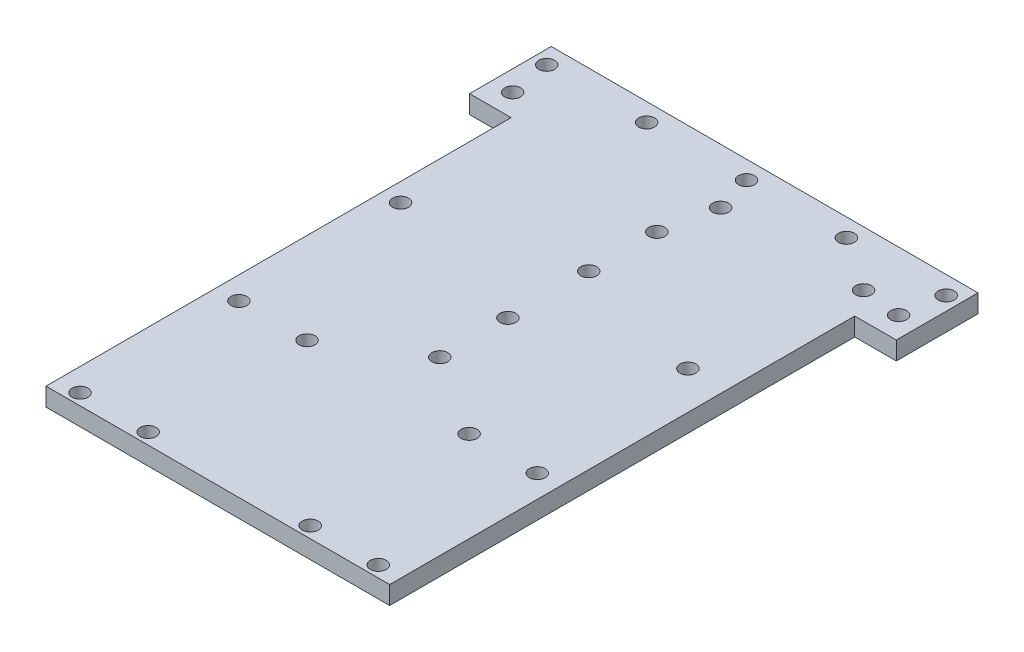
ISO-10303-21;
HEADER;
FILE_DESCRIPTION(('STEP AP214'),'2;1');
FILE_NAME('part.step','',(''),(''),'','','');
FILE_SCHEMA(('AUTOMOTIVE_DESIGN { 1 0 10303 214 1 1 1 1 }'));
ENDSEC;
DATA;
#1=APPLICATION_CONTEXT('core data for automotive mechanical design processes');
#2=APPLICATION_PROTOCOL_DEFINITION('international standard','automotive_design',2000,#1);
#3=PRODUCT_CONTEXT('',#1,'mechanical');
#4=PRODUCT('Part','Part','',(#3));
#5=PRODUCT_RELATED_PRODUCT_CATEGORY('part','',(#4));
#6=PRODUCT_DEFINITION_FORMATION('','',#4);
#7=PRODUCT_DEFINITION_CONTEXT('part definition',#1,'design');
#8=PRODUCT_DEFINITION('design','',#6,#7);
#9=PRODUCT_DEFINITION_SHAPE('','',#8);
#10=(LENGTH_UNIT() NAMED_UNIT(*) SI_UNIT(.MILLI.,.METRE.));
#11=(NAMED_UNIT(*) PLANE_ANGLE_UNIT() SI_UNIT($,.RADIAN.));
#12=(NAMED_UNIT(*) SI_UNIT($,.STERADIAN.) SOLID_ANGLE_UNIT());
#13=UNCERTAINTY_MEASURE_WITH_UNIT(LENGTH_MEASURE(1.E-05),#10,'distance_accuracy_value','');
#14=(GEOMETRIC_REPRESENTATION_CONTEXT(3) GLOBAL_UNCERTAINTY_ASSIGNED_CONTEXT((#13)) GLOBAL_UNIT_ASSIGNED_CONTEXT((#10,
#11,#12)) REPRESENTATION_CONTEXT('',''));
#15=CARTESIAN_POINT('',(0.,0.,0.));
#16=DIRECTION('',(0.,0.,1.));
#17=DIRECTION('',(1.,0.,0.));
#18=AXIS2_PLACEMENT_3D('',#15,#16,#17);
#19=CARTESIAN_POINT('',(37.85,4.,-21.35));
#20=DIRECTION('',(-1.,0.,0.));
#21=DIRECTION('',(0.,0.,1.));
#22=AXIS2_PLACEMENT_3D('',#19,#20,#21);
#23=PLANE('',#22);
#24=DIRECTION('',(0.,-1.,0.));
#25=VECTOR('',#24,1.);
#26=CARTESIAN_POINT('',(37.85,4.,-11.35));
#27=LINE('',#26,#25);
#28=CARTESIAN_POINT('',(37.85,4.,-11.35));
#29=VERTEX_POINT('',#28);
#30=CARTESIAN_POINT('',(37.85,0.,-11.35));
#31=VERTEX_POINT('',#30);
#32=EDGE_CURVE('E60',#29,#31,#27,.T.);
#33=ORIENTED_EDGE('',*,*,#32,.F.);
#34=DIRECTION('',(0.,0.,-1.));
#35=VECTOR('',#34,1.);
#36=CARTESIAN_POINT('',(37.85,4.,-21.35));
#37=LINE('',#36,#35);
#38=CARTESIAN_POINT('',(37.85,4.,91.1));
#39=VERTEX_POINT('',#38);
#40=EDGE_CURVE('E52',#39,#29,#37,.T.);
#41=ORIENTED_EDGE('',*,*,#40,.F.);
#42=DIRECTION('',(0.,-1.,0.));
#43=VECTOR('',#42,1.);
#44=CARTESIAN_POINT('',(37.85,4.,91.1));
#45=LINE('',#44,#43);
#46=CARTESIAN_POINT('',(37.85,0.,91.1));
#47=VERTEX_POINT('',#46);
#48=EDGE_CURVE('E298',#39,#47,#45,.T.);
#49=ORIENTED_EDGE('',*,*,#48,.T.);
#50=DIRECTION('',(0.,0.,-1.));
#51=VECTOR('',#50,1.);
#52=CARTESIAN_POINT('',(37.85,0.,-21.35));
#53=LINE('',#52,#51);
#54=EDGE_CURVE('E65',#47,#31,#53,.T.);
#55=ORIENTED_EDGE('',*,*,#54,.T.);
#56=EDGE_LOOP('',(#33,#41,#49,#55));
#57=FACE_BOUND('',#56,.T.);
#58=ADVANCED_FACE('F43',(#57),#23,.F.);
#59=CARTESIAN_POINT('',(-37.85,4.,-21.35));
#60=DIRECTION('',(1.,0.,0.));
#61=DIRECTION('',(0.,0.,-1.));
#62=AXIS2_PLACEMENT_3D('',#59,#60,#61);
#63=PLANE('',#62);
#64=DIRECTION('',(0.,-1.,0.));
#65=VECTOR('',#64,1.);
#66=CARTESIAN_POINT('',(-37.85,4.,-11.35));
#67=LINE('',#66,#65);
#68=CARTESIAN_POINT('',(-37.85,4.,-11.35));
#69=VERTEX_POINT('',#68);
#70=CARTESIAN_POINT('',(-37.85,0.,-11.35));
#71=VERTEX_POINT('',#70);
#72=EDGE_CURVE('E161',#69,#71,#67,.T.);
#73=ORIENTED_EDGE('',*,*,#72,.T.);
#74=DIRECTION('',(0.,0.,1.));
#75=VECTOR('',#74,1.);
#76=CARTESIAN_POINT('',(-37.85,0.,-21.35));
#77=LINE('',#76,#75);
#78=CARTESIAN_POINT('',(-37.85,0.,91.1));
#79=VERTEX_POINT('',#78);
#80=EDGE_CURVE('E46',#71,#79,#77,.T.);
#81=ORIENTED_EDGE('',*,*,#80,.T.);
#82=DIRECTION('',(0.,-1.,0.));
#83=VECTOR('',#82,1.);
#84=CARTESIAN_POINT('',(-37.85,4.,91.1));
#85=LINE('',#84,#83);
#86=CARTESIAN_POINT('',(-37.85,4.,91.1));
#87=VERTEX_POINT('',#86);
#88=EDGE_CURVE('E304',#87,#79,#85,.T.);
#89=ORIENTED_EDGE('',*,*,#88,.F.);
#90=DIRECTION('',(0.,0.,1.));
#91=VECTOR('',#90,1.);
#92=CARTESIAN_POINT('',(-37.85,4.,-21.35));
#93=LINE('',#92,#91);
#94=EDGE_CURVE('E11',#69,#87,#93,.T.);
#95=ORIENTED_EDGE('',*,*,#94,.F.);
#96=EDGE_LOOP('',(#73,#81,#89,#95));
#97=FACE_BOUND('',#96,.T.);
#98=ADVANCED_FACE('F378',(#97),#63,.F.);
#99=CARTESIAN_POINT('',(0.,4.,0.));
#100=DIRECTION('',(0.,1.,0.));
#101=DIRECTION('',(0.,0.,1.));
#102=AXIS2_PLACEMENT_3D('',#99,#100,#101);
#103=PLANE('',#102);
#104=ORIENTED_EDGE('',*,*,#40,.T.);
#105=DIRECTION('',(1.,0.,0.));
#106=VECTOR('',#105,1.);
#107=CARTESIAN_POINT('',(47.,4.,-11.35));
#108=LINE('',#107,#106);
#109=CARTESIAN_POINT('',(47.,4.,-11.35));
#110=VERTEX_POINT('',#109);
#111=EDGE_CURVE('E129',#29,#110,#108,.T.);
#112=ORIENTED_EDGE('',*,*,#111,.T.);
#113=DIRECTION('',(0.,0.,1.));
#114=VECTOR('',#113,1.);
#115=CARTESIAN_POINT('',(47.,4.,0.));
#116=LINE('',#115,#114);
#117=CARTESIAN_POINT('',(47.,4.,-29.35));
#118=VERTEX_POINT('',#117);
#119=EDGE_CURVE('E133',#118,#110,#116,.T.);
#120=ORIENTED_EDGE('',*,*,#119,.F.);
#121=DIRECTION('',(-1.,0.,0.));
#122=VECTOR('',#121,1.);
#123=CARTESIAN_POINT('',(-44.,4.,-29.35));
#124=LINE('',#123,#122);
#125=CARTESIAN_POINT('',(-47.,4.,-29.35));
#126=VERTEX_POINT('',#125);
#127=EDGE_CURVE('E224',#118,#126,#124,.T.);
#128=ORIENTED_EDGE('',*,*,#127,.T.);
#129=DIRECTION('',(0.,0.,1.));
#130=VECTOR('',#129,1.);
#131=CARTESIAN_POINT('',(-47.,4.,0.));
#132=LINE('',#131,#130);
#133=CARTESIAN_POINT('',(-47.,4.,-11.35));
#134=VERTEX_POINT('',#133);
#135=EDGE_CURVE('E212',#126,#134,#132,.T.);
#136=ORIENTED_EDGE('',*,*,#135,.T.);
#137=DIRECTION('',(1.,0.,0.));
#138=VECTOR('',#137,1.);
#139=CARTESIAN_POINT('',(-47.,4.,-11.35));
#140=LINE('',#139,#138);
#141=EDGE_CURVE('E158',#134,#69,#140,.T.);
#142=ORIENTED_EDGE('',*,*,#141,.T.);
#143=ORIENTED_EDGE('',*,*,#94,.T.);
#144=DIRECTION('',(1.,0.,0.));
#145=VECTOR('',#144,1.);
#146=CARTESIAN_POINT('',(-37.85,4.,91.1));
#147=LINE('',#146,#145);
#148=EDGE_CURVE('E294',#87,#39,#147,.T.);
#149=ORIENTED_EDGE('',*,*,#148,.T.);
#150=EDGE_LOOP('',(#104,#112,#120,#128,#136,#142,#143,#149));
#151=FACE_BOUND('',#150,.T.);
#152=CARTESIAN_POINT('',(-44.,4.,-25.35));
#153=DIRECTION('',(0.,1.,0.));
#154=DIRECTION('',(0.,0.,1.));
#155=AXIS2_PLACEMENT_3D('',#152,#153,#154);
#156=CIRCLE('',#155,1.75);
#157=CARTESIAN_POINT('',(-44.,4.,-23.6));
#158=VERTEX_POINT('',#157);
#159=EDGE_CURVE('E206',#158,#158,#156,.T.);
#160=ORIENTED_EDGE('',*,*,#159,.F.);
#161=EDGE_LOOP('',(#160));
#162=FACE_BOUND('',#161,.T.);
#163=CARTESIAN_POINT('',(0.,4.,-25.35));
#164=DIRECTION('',(0.,1.,0.));
#165=DIRECTION('',(0.,0.,1.));
#166=AXIS2_PLACEMENT_3D('',#163,#164,#165);
#167=CIRCLE('',#166,1.75);
#168=CARTESIAN_POINT('',(0.,4.,-23.6));
#169=VERTEX_POINT('',#168);
#170=EDGE_CURVE('E172',#169,#169,#167,.T.);
#171=ORIENTED_EDGE('',*,*,#170,.F.);
#172=EDGE_LOOP('',(#171));
#173=FACE_BOUND('',#172,.T.);
#174=CARTESIAN_POINT('',(44.,4.,-25.35));
#175=DIRECTION('',(0.,1.,0.));
#176=DIRECTION('',(0.,0.,1.));
#177=AXIS2_PLACEMENT_3D('',#174,#175,#176);
#178=CIRCLE('',#177,1.75);
#179=CARTESIAN_POINT('',(44.,4.,-23.6));
#180=VERTEX_POINT('',#179);
#181=EDGE_CURVE('E184',#180,#180,#178,.T.);
#182=ORIENTED_EDGE('',*,*,#181,.F.);
#183=EDGE_LOOP('',(#182));
#184=FACE_BOUND('',#183,.T.);
#185=CARTESIAN_POINT('',(22.,4.,-25.35));
#186=DIRECTION('',(0.,1.,0.));
#187=DIRECTION('',(0.,0.,1.));
#188=AXIS2_PLACEMENT_3D('',#185,#186,#187);
#189=CIRCLE('',#188,1.75);
#190=CARTESIAN_POINT('',(22.,4.,-23.6));
#191=VERTEX_POINT('',#190);
#192=EDGE_CURVE('E189',#191,#191,#189,.T.);
#193=ORIENTED_EDGE('',*,*,#192,.F.);
#194=EDGE_LOOP('',(#193));
#195=FACE_BOUND('',#194,.T.);
#196=CARTESIAN_POINT('',(-22.,4.,-25.35));
#197=DIRECTION('',(0.,1.,0.));
#198=DIRECTION('',(0.,0.,1.));
#199=AXIS2_PLACEMENT_3D('',#196,#197,#198);
#200=CIRCLE('',#199,1.75);
#201=CARTESIAN_POINT('',(-22.,4.,-23.6));
#202=VERTEX_POINT('',#201);
#203=EDGE_CURVE('E180',#202,#202,#200,.T.);
#204=ORIENTED_EDGE('',*,*,#203,.F.);
#205=EDGE_LOOP('',(#204));
#206=FACE_BOUND('',#205,.T.);
#207=CARTESIAN_POINT('',(0.,4.,-5.6));
#208=DIRECTION('',(0.,1.,0.));
#209=DIRECTION('',(0.,0.,1.));
#210=AXIS2_PLACEMENT_3D('',#207,#208,#209);
#211=CIRCLE('',#210,1.75);
#212=CARTESIAN_POINT('',(0.,4.,-3.85));
#213=VERTEX_POINT('',#212);
#214=EDGE_CURVE('E314',#213,#213,#211,.T.);
#215=ORIENTED_EDGE('',*,*,#214,.F.);
#216=EDGE_LOOP('',(#215));
#217=FACE_BOUND('',#216,.T.);
#218=CARTESIAN_POINT('',(0.,4.,9.4));
#219=DIRECTION('',(0.,1.,0.));
#220=DIRECTION('',(0.,0.,1.));
#221=AXIS2_PLACEMENT_3D('',#218,#219,#220);
#222=CIRCLE('',#221,1.75);
#223=CARTESIAN_POINT('',(0.,4.,11.15));
#224=VERTEX_POINT('',#223);
#225=EDGE_CURVE('E318',#224,#224,#222,.T.);
#226=ORIENTED_EDGE('',*,*,#225,.F.);
#227=EDGE_LOOP('',(#226));
#228=FACE_BOUND('',#227,.T.);
#229=CARTESIAN_POINT('',(29.5,4.,17.05));
#230=DIRECTION('',(0.,1.,0.));
#231=DIRECTION('',(0.,0.,1.));
#232=AXIS2_PLACEMENT_3D('',#229,#230,#231);
#233=CIRCLE('',#232,1.75);
#234=CARTESIAN_POINT('',(29.5,4.,18.8));
#235=VERTEX_POINT('',#234);
#236=EDGE_CURVE('E349',#235,#235,#233,.T.);
#237=ORIENTED_EDGE('',*,*,#236,.F.);
#238=EDGE_LOOP('',(#237));
#239=FACE_BOUND('',#238,.T.);
#240=CARTESIAN_POINT('',(2.39999999999999,4.,-17.25));
#241=DIRECTION('',(0.,1.,0.));
#242=DIRECTION('',(0.,0.,1.));
#243=AXIS2_PLACEMENT_3D('',#240,#241,#242);
#244=CIRCLE('',#243,1.75);
#245=CARTESIAN_POINT('',(2.39999999999999,4.,-15.5));
#246=VERTEX_POINT('',#245);
#247=EDGE_CURVE('E365',#246,#246,#244,.T.);
#248=ORIENTED_EDGE('',*,*,#247,.F.);
#249=EDGE_LOOP('',(#248));
#250=FACE_BOUND('',#249,.T.);
#251=CARTESIAN_POINT('',(-33.8,4.,17.05));
#252=DIRECTION('',(0.,1.,0.));
#253=DIRECTION('',(0.,0.,1.));
#254=AXIS2_PLACEMENT_3D('',#251,#252,#253);
#255=CIRCLE('',#254,1.75);
#256=CARTESIAN_POINT('',(-33.8,4.,18.8));
#257=VERTEX_POINT('',#256);
#258=EDGE_CURVE('E357',#257,#257,#255,.T.);
#259=ORIENTED_EDGE('',*,*,#258,.F.);
#260=EDGE_LOOP('',(#259));
#261=FACE_BOUND('',#260,.T.);
#262=CARTESIAN_POINT('',(33.9,4.,-17.25));
#263=DIRECTION('',(0.,1.,0.));
#264=DIRECTION('',(0.,0.,1.));
#265=AXIS2_PLACEMENT_3D('',#262,#263,#264);
#266=CIRCLE('',#265,1.75);
#267=CARTESIAN_POINT('',(33.9,4.,-15.5));
#268=VERTEX_POINT('',#267);
#269=EDGE_CURVE('E341',#268,#268,#266,.T.);
#270=ORIENTED_EDGE('',*,*,#269,.F.);
#271=EDGE_LOOP('',(#270));
#272=FACE_BOUND('',#271,.T.);
#273=CARTESIAN_POINT('',(0.,4.,42.2));
#274=DIRECTION('',(0.,1.,0.));
#275=DIRECTION('',(0.,0.,1.));
#276=AXIS2_PLACEMENT_3D('',#273,#274,#275);
#277=CIRCLE('',#276,1.75);
#278=CARTESIAN_POINT('',(0.,4.,43.95));
#279=VERTEX_POINT('',#278);
#280=EDGE_CURVE('E313',#279,#279,#277,.T.);
#281=ORIENTED_EDGE('',*,*,#280,.F.);
#282=EDGE_LOOP('',(#281));
#283=FACE_BOUND('',#282,.T.);
#284=CARTESIAN_POINT('',(0.,4.,27.2));
#285=DIRECTION('',(0.,1.,0.));
#286=DIRECTION('',(0.,0.,1.));
#287=AXIS2_PLACEMENT_3D('',#284,#285,#286);
#288=CIRCLE('',#287,1.75);
#289=CARTESIAN_POINT('',(0.,4.,28.95));
#290=VERTEX_POINT('',#289);
#291=EDGE_CURVE('E330',#290,#290,#288,.T.);
#292=ORIENTED_EDGE('',*,*,#291,.F.);
#293=EDGE_LOOP('',(#292));
#294=FACE_BOUND('',#293,.T.);
#295=CARTESIAN_POINT('',(17.85,4.,53.6));
#296=DIRECTION('',(0.,1.,0.));
#297=DIRECTION('',(0.,0.,-1.));
#298=AXIS2_PLACEMENT_3D('',#295,#296,#297);
#299=CIRCLE('',#298,1.75);
#300=CARTESIAN_POINT('',(17.85,4.,51.85));
#301=VERTEX_POINT('',#300);
#302=EDGE_CURVE('E238',#301,#301,#299,.T.);
#303=ORIENTED_EDGE('',*,*,#302,.F.);
#304=EDGE_LOOP('',(#303));
#305=FACE_BOUND('',#304,.T.);
#306=CARTESIAN_POINT('',(32.85,4.,88.6));
#307=DIRECTION('',(0.,1.,0.));
#308=DIRECTION('',(0.,0.,-1.));
#309=AXIS2_PLACEMENT_3D('',#306,#307,#308);
#310=CIRCLE('',#309,1.75);
#311=CARTESIAN_POINT('',(32.85,4.,86.85));
#312=VERTEX_POINT('',#311);
#313=EDGE_CURVE('E254',#312,#312,#310,.T.);
#314=ORIENTED_EDGE('',*,*,#313,.F.);
#315=EDGE_LOOP('',(#314));
#316=FACE_BOUND('',#315,.T.);
#317=CARTESIAN_POINT('',(-17.85,4.,88.6));
#318=DIRECTION('',(0.,1.,0.));
#319=DIRECTION('',(0.,0.,1.));
#320=AXIS2_PLACEMENT_3D('',#317,#318,#319);
#321=CIRCLE('',#320,1.75);
#322=CARTESIAN_POINT('',(-17.85,4.,90.35));
#323=VERTEX_POINT('',#322);
#324=EDGE_CURVE('E270',#323,#323,#321,.T.);
#325=ORIENTED_EDGE('',*,*,#324,.F.);
#326=EDGE_LOOP('',(#325));
#327=FACE_BOUND('',#326,.T.);
#328=CARTESIAN_POINT('',(-32.85,4.,53.6));
#329=DIRECTION('',(0.,1.,0.));
#330=DIRECTION('',(0.,0.,1.));
#331=AXIS2_PLACEMENT_3D('',#328,#329,#330);
#332=CIRCLE('',#331,1.75);
#333=CARTESIAN_POINT('',(-32.85,4.,55.35));
#334=VERTEX_POINT('',#333);
#335=EDGE_CURVE('E286',#334,#334,#332,.T.);
#336=ORIENTED_EDGE('',*,*,#335,.F.);
#337=EDGE_LOOP('',(#336));
#338=FACE_BOUND('',#337,.T.);
#339=CARTESIAN_POINT('',(-17.85,4.,53.6));
#340=DIRECTION('',(0.,1.,0.));
#341=DIRECTION('',(0.,0.,1.));
#342=AXIS2_PLACEMENT_3D('',#339,#340,#341);
#343=CIRCLE('',#342,1.75);
#344=CARTESIAN_POINT('',(-17.85,4.,55.35));
#345=VERTEX_POINT('',#344);
#346=EDGE_CURVE('E278',#345,#345,#343,.T.);
#347=ORIENTED_EDGE('',*,*,#346,.F.);
#348=EDGE_LOOP('',(#347));
#349=FACE_BOUND('',#348,.T.);
#350=CARTESIAN_POINT('',(-32.85,4.,88.6));
#351=DIRECTION('',(0.,1.,0.));
#352=DIRECTION('',(0.,0.,1.));
#353=AXIS2_PLACEMENT_3D('',#350,#351,#352);
#354=CIRCLE('',#353,1.75);
#355=CARTESIAN_POINT('',(-32.85,4.,90.35));
#356=VERTEX_POINT('',#355);
#357=EDGE_CURVE('E262',#356,#356,#354,.T.);
#358=ORIENTED_EDGE('',*,*,#357,.F.);
#359=EDGE_LOOP('',(#358));
#360=FACE_BOUND('',#359,.T.);
#361=CARTESIAN_POINT('',(17.85,4.,88.6));
#362=DIRECTION('',(0.,1.,0.));
#363=DIRECTION('',(0.,0.,-1.));
#364=AXIS2_PLACEMENT_3D('',#361,#362,#363);
#365=CIRCLE('',#364,1.75);
#366=CARTESIAN_POINT('',(17.85,4.,86.85));
#367=VERTEX_POINT('',#366);
#368=EDGE_CURVE('E246',#367,#367,#365,.T.);
#369=ORIENTED_EDGE('',*,*,#368,.F.);
#370=EDGE_LOOP('',(#369));
#371=FACE_BOUND('',#370,.T.);
#372=CARTESIAN_POINT('',(32.85,4.,53.6));
#373=DIRECTION('',(0.,1.,0.));
#374=DIRECTION('',(0.,0.,-1.));
#375=AXIS2_PLACEMENT_3D('',#372,#373,#374);
#376=CIRCLE('',#375,1.75);
#377=CARTESIAN_POINT('',(32.85,4.,51.85));
#378=VERTEX_POINT('',#377);
#379=EDGE_CURVE('E230',#378,#378,#376,.T.);
#380=ORIENTED_EDGE('',*,*,#379,.F.);
#381=EDGE_LOOP('',(#380));
#382=FACE_BOUND('',#381,.T.);
#383=CARTESIAN_POINT('',(-42.5,4.,-16.35));
#384=DIRECTION('',(0.,1.,0.));
#385=DIRECTION('',(0.,0.,1.));
#386=AXIS2_PLACEMENT_3D('',#383,#384,#385);
#387=CIRCLE('',#386,1.75);
#388=CARTESIAN_POINT('',(-42.5,4.,-14.6));
#389=VERTEX_POINT('',#388);
#390=EDGE_CURVE('E150',#389,#389,#387,.T.);
#391=ORIENTED_EDGE('',*,*,#390,.F.);
#392=EDGE_LOOP('',(#391));
#393=FACE_BOUND('',#392,.T.);
#394=CARTESIAN_POINT('',(42.5,4.,-16.35));
#395=DIRECTION('',(0.,1.,0.));
#396=DIRECTION('',(0.,0.,1.));
#397=AXIS2_PLACEMENT_3D('',#394,#395,#396);
#398=CIRCLE('',#397,1.75);
#399=CARTESIAN_POINT('',(42.5,4.,-14.6));
#400=VERTEX_POINT('',#399);
#401=EDGE_CURVE('E128',#400,#400,#398,.T.);
#402=ORIENTED_EDGE('',*,*,#401,.F.);
#403=EDGE_LOOP('',(#402));
#404=FACE_BOUND('',#403,.T.);
#405=ADVANCED_FACE('F388',(#151,#162,#173,#184,#195,#206,#217,#228,#239,#250,#261,#272,#283,
#294,#305,#316,#327,#338,#349,#360,#371,#382,#393,#404),#103,.T.);
#406=CARTESIAN_POINT('',(0.,0.,0.));
#407=DIRECTION('',(0.,1.,0.));
#408=DIRECTION('',(0.,0.,1.));
#409=AXIS2_PLACEMENT_3D('',#406,#407,#408);
#410=PLANE('',#409);
#411=DIRECTION('',(1.,0.,0.));
#412=VECTOR('',#411,1.);
#413=CARTESIAN_POINT('',(47.,0.,-11.35));
#414=LINE('',#413,#412);
#415=CARTESIAN_POINT('',(47.,0.,-11.35));
#416=VERTEX_POINT('',#415);
#417=EDGE_CURVE('E111',#31,#416,#414,.T.);
#418=ORIENTED_EDGE('',*,*,#417,.F.);
#419=ORIENTED_EDGE('',*,*,#54,.F.);
#420=DIRECTION('',(1.,0.,0.));
#421=VECTOR('',#420,1.);
#422=CARTESIAN_POINT('',(-37.85,0.,91.1));
#423=LINE('',#422,#421);
#424=EDGE_CURVE('E290',#79,#47,#423,.T.);
#425=ORIENTED_EDGE('',*,*,#424,.F.);
#426=ORIENTED_EDGE('',*,*,#80,.F.);
#427=DIRECTION('',(1.,0.,0.));
#428=VECTOR('',#427,1.);
#429=CARTESIAN_POINT('',(-47.,0.,-11.35));
#430=LINE('',#429,#428);
#431=CARTESIAN_POINT('',(-47.,0.,-11.35));
#432=VERTEX_POINT('',#431);
#433=EDGE_CURVE('E154',#432,#71,#430,.T.);
#434=ORIENTED_EDGE('',*,*,#433,.F.);
#435=DIRECTION('',(0.,0.,1.));
#436=VECTOR('',#435,1.);
#437=CARTESIAN_POINT('',(-47.,0.,0.));
#438=LINE('',#437,#436);
#439=CARTESIAN_POINT('',(-47.,0.,-29.35));
#440=VERTEX_POINT('',#439);
#441=EDGE_CURVE('E211',#440,#432,#438,.T.);
#442=ORIENTED_EDGE('',*,*,#441,.F.);
#443=DIRECTION('',(-1.,0.,0.));
#444=VECTOR('',#443,1.);
#445=CARTESIAN_POINT('',(-44.,0.,-29.35));
#446=LINE('',#445,#444);
#447=CARTESIAN_POINT('',(47.,0.,-29.35));
#448=VERTEX_POINT('',#447);
#449=EDGE_CURVE('E113',#448,#440,#446,.T.);
#450=ORIENTED_EDGE('',*,*,#449,.F.);
#451=DIRECTION('',(0.,0.,1.));
#452=VECTOR('',#451,1.);
#453=CARTESIAN_POINT('',(47.,0.,0.));
#454=LINE('',#453,#452);
#455=EDGE_CURVE('E107',#448,#416,#454,.T.);
#456=ORIENTED_EDGE('',*,*,#455,.T.);
#457=EDGE_LOOP('',(#418,#419,#425,#426,#434,#442,#450,#456));
#458=FACE_BOUND('',#457,.T.);
#459=CARTESIAN_POINT('',(0.,0.,-25.35));
#460=DIRECTION('',(0.,1.,0.));
#461=DIRECTION('',(0.,0.,1.));
#462=AXIS2_PLACEMENT_3D('',#459,#460,#461);
#463=CIRCLE('',#462,1.75);
#464=CARTESIAN_POINT('',(0.,0.,-23.6));
#465=VERTEX_POINT('',#464);
#466=EDGE_CURVE('E171',#465,#465,#463,.T.);
#467=ORIENTED_EDGE('',*,*,#466,.T.);
#468=EDGE_LOOP('',(#467));
#469=FACE_BOUND('',#468,.T.);
#470=CARTESIAN_POINT('',(22.,0.,-25.35));
#471=DIRECTION('',(0.,1.,0.));
#472=DIRECTION('',(0.,0.,1.));
#473=AXIS2_PLACEMENT_3D('',#470,#471,#472);
#474=CIRCLE('',#473,1.75);
#475=CARTESIAN_POINT('',(22.,0.,-23.6));
#476=VERTEX_POINT('',#475);
#477=EDGE_CURVE('E176',#476,#476,#474,.T.);
#478=ORIENTED_EDGE('',*,*,#477,.T.);
#479=EDGE_LOOP('',(#478));
#480=FACE_BOUND('',#479,.T.);
#481=CARTESIAN_POINT('',(-22.,0.,-25.35));
#482=DIRECTION('',(0.,1.,0.));
#483=DIRECTION('',(0.,0.,1.));
#484=AXIS2_PLACEMENT_3D('',#481,#482,#483);
#485=CIRCLE('',#484,1.75);
#486=CARTESIAN_POINT('',(-22.,0.,-23.6));
#487=VERTEX_POINT('',#486);
#488=EDGE_CURVE('E185',#487,#487,#485,.T.);
#489=ORIENTED_EDGE('',*,*,#488,.T.);
#490=EDGE_LOOP('',(#489));
#491=FACE_BOUND('',#490,.T.);
#492=CARTESIAN_POINT('',(44.,0.,-25.35));
#493=DIRECTION('',(0.,1.,0.));
#494=DIRECTION('',(0.,0.,1.));
#495=AXIS2_PLACEMENT_3D('',#492,#493,#494);
#496=CIRCLE('',#495,1.75);
#497=CARTESIAN_POINT('',(44.,0.,-23.6));
#498=VERTEX_POINT('',#497);
#499=EDGE_CURVE('E120',#498,#498,#496,.T.);
#500=ORIENTED_EDGE('',*,*,#499,.T.);
#501=EDGE_LOOP('',(#500));
#502=FACE_BOUND('',#501,.T.);
#503=CARTESIAN_POINT('',(-44.,0.,-25.35));
#504=DIRECTION('',(0.,1.,0.));
#505=DIRECTION('',(0.,0.,1.));
#506=AXIS2_PLACEMENT_3D('',#503,#504,#505);
#507=CIRCLE('',#506,1.75);
#508=CARTESIAN_POINT('',(-44.,0.,-23.6));
#509=VERTEX_POINT('',#508);
#510=EDGE_CURVE('E207',#509,#509,#507,.T.);
#511=ORIENTED_EDGE('',*,*,#510,.T.);
#512=EDGE_LOOP('',(#511));
#513=FACE_BOUND('',#512,.T.);
#514=CARTESIAN_POINT('',(0.,0.,-5.6));
#515=DIRECTION('',(0.,1.,0.));
#516=DIRECTION('',(0.,0.,1.));
#517=AXIS2_PLACEMENT_3D('',#514,#515,#516);
#518=CIRCLE('',#517,1.75);
#519=CARTESIAN_POINT('',(0.,0.,-3.85));
#520=VERTEX_POINT('',#519);
#521=EDGE_CURVE('E309',#520,#520,#518,.T.);
#522=ORIENTED_EDGE('',*,*,#521,.T.);
#523=EDGE_LOOP('',(#522));
#524=FACE_BOUND('',#523,.T.);
#525=CARTESIAN_POINT('',(0.,0.,9.4));
#526=DIRECTION('',(0.,1.,0.));
#527=DIRECTION('',(0.,0.,1.));
#528=AXIS2_PLACEMENT_3D('',#525,#526,#527);
#529=CIRCLE('',#528,1.75);
#530=CARTESIAN_POINT('',(0.,0.,11.15));
#531=VERTEX_POINT('',#530);
#532=EDGE_CURVE('E308',#531,#531,#529,.T.);
#533=ORIENTED_EDGE('',*,*,#532,.T.);
#534=EDGE_LOOP('',(#533));
#535=FACE_BOUND('',#534,.T.);
#536=CARTESIAN_POINT('',(2.39999999999999,0.,-17.25));
#537=DIRECTION('',(0.,1.,0.));
#538=DIRECTION('',(0.,0.,1.));
#539=AXIS2_PLACEMENT_3D('',#536,#537,#538);
#540=CIRCLE('',#539,1.75);
#541=CARTESIAN_POINT('',(2.39999999999999,0.,-15.5));
#542=VERTEX_POINT('',#541);
#543=EDGE_CURVE('E361',#542,#542,#540,.T.);
#544=ORIENTED_EDGE('',*,*,#543,.T.);
#545=EDGE_LOOP('',(#544));
#546=FACE_BOUND('',#545,.T.);
#547=CARTESIAN_POINT('',(-33.8,0.,17.05));
#548=DIRECTION('',(0.,1.,0.));
#549=DIRECTION('',(0.,0.,1.));
#550=AXIS2_PLACEMENT_3D('',#547,#548,#549);
#551=CIRCLE('',#550,1.75);
#552=CARTESIAN_POINT('',(-33.8,0.,18.8));
#553=VERTEX_POINT('',#552);
#554=EDGE_CURVE('E353',#553,#553,#551,.T.);
#555=ORIENTED_EDGE('',*,*,#554,.T.);
#556=EDGE_LOOP('',(#555));
#557=FACE_BOUND('',#556,.T.);
#558=CARTESIAN_POINT('',(29.5,0.,17.05));
#559=DIRECTION('',(0.,1.,0.));
#560=DIRECTION('',(0.,0.,1.));
#561=AXIS2_PLACEMENT_3D('',#558,#559,#560);
#562=CIRCLE('',#561,1.75);
#563=CARTESIAN_POINT('',(29.5,0.,18.8));
#564=VERTEX_POINT('',#563);
#565=EDGE_CURVE('E345',#564,#564,#562,.T.);
#566=ORIENTED_EDGE('',*,*,#565,.T.);
#567=EDGE_LOOP('',(#566));
#568=FACE_BOUND('',#567,.T.);
#569=CARTESIAN_POINT('',(33.9,0.,-17.25));
#570=DIRECTION('',(0.,1.,0.));
#571=DIRECTION('',(0.,0.,1.));
#572=AXIS2_PLACEMENT_3D('',#569,#570,#571);
#573=CIRCLE('',#572,1.75);
#574=CARTESIAN_POINT('',(33.9,0.,-15.5));
#575=VERTEX_POINT('',#574);
#576=EDGE_CURVE('E334',#575,#575,#573,.T.);
#577=ORIENTED_EDGE('',*,*,#576,.T.);
#578=EDGE_LOOP('',(#577));
#579=FACE_BOUND('',#578,.T.);
#580=CARTESIAN_POINT('',(0.,0.,42.2));
#581=DIRECTION('',(0.,1.,0.));
#582=DIRECTION('',(0.,0.,1.));
#583=AXIS2_PLACEMENT_3D('',#580,#581,#582);
#584=CIRCLE('',#583,1.75);
#585=CARTESIAN_POINT('',(0.,0.,43.95));
#586=VERTEX_POINT('',#585);
#587=EDGE_CURVE('E325',#586,#586,#584,.T.);
#588=ORIENTED_EDGE('',*,*,#587,.T.);
#589=EDGE_LOOP('',(#588));
#590=FACE_BOUND('',#589,.T.);
#591=CARTESIAN_POINT('',(0.,0.,27.2));
#592=DIRECTION('',(0.,1.,0.));
#593=DIRECTION('',(0.,0.,1.));
#594=AXIS2_PLACEMENT_3D('',#591,#592,#593);
#595=CIRCLE('',#594,1.75);
#596=CARTESIAN_POINT('',(0.,0.,28.95));
#597=VERTEX_POINT('',#596);
#598=EDGE_CURVE('E329',#597,#597,#595,.T.);
#599=ORIENTED_EDGE('',*,*,#598,.T.);
#600=EDGE_LOOP('',(#599));
#601=FACE_BOUND('',#600,.T.);
#602=CARTESIAN_POINT('',(-32.85,0.,53.6));
#603=DIRECTION('',(0.,1.,0.));
#604=DIRECTION('',(0.,0.,1.));
#605=AXIS2_PLACEMENT_3D('',#602,#603,#604);
#606=CIRCLE('',#605,1.75);
#607=CARTESIAN_POINT('',(-32.85,0.,55.35));
#608=VERTEX_POINT('',#607);
#609=EDGE_CURVE('E282',#608,#608,#606,.T.);
#610=ORIENTED_EDGE('',*,*,#609,.T.);
#611=EDGE_LOOP('',(#610));
#612=FACE_BOUND('',#611,.T.);
#613=CARTESIAN_POINT('',(-17.85,0.,53.6));
#614=DIRECTION('',(0.,1.,0.));
#615=DIRECTION('',(0.,0.,1.));
#616=AXIS2_PLACEMENT_3D('',#613,#614,#615);
#617=CIRCLE('',#616,1.75);
#618=CARTESIAN_POINT('',(-17.85,0.,55.35));
#619=VERTEX_POINT('',#618);
#620=EDGE_CURVE('E274',#619,#619,#617,.T.);
#621=ORIENTED_EDGE('',*,*,#620,.T.);
#622=EDGE_LOOP('',(#621));
#623=FACE_BOUND('',#622,.T.);
#624=CARTESIAN_POINT('',(-17.85,0.,88.6));
#625=DIRECTION('',(0.,1.,0.));
#626=DIRECTION('',(0.,0.,1.));
#627=AXIS2_PLACEMENT_3D('',#624,#625,#626);
#628=CIRCLE('',#627,1.75);
#629=CARTESIAN_POINT('',(-17.85,0.,90.35));
#630=VERTEX_POINT('',#629);
#631=EDGE_CURVE('E266',#630,#630,#628,.T.);
#632=ORIENTED_EDGE('',*,*,#631,.T.);
#633=EDGE_LOOP('',(#632));
#634=FACE_BOUND('',#633,.T.);
#635=CARTESIAN_POINT('',(-32.85,0.,88.6));
#636=DIRECTION('',(0.,1.,0.));
#637=DIRECTION('',(0.,0.,1.));
#638=AXIS2_PLACEMENT_3D('',#635,#636,#637);
#639=CIRCLE('',#638,1.75);
#640=CARTESIAN_POINT('',(-32.85,0.,90.35));
#641=VERTEX_POINT('',#640);
#642=EDGE_CURVE('E258',#641,#641,#639,.T.);
#643=ORIENTED_EDGE('',*,*,#642,.T.);
#644=EDGE_LOOP('',(#643));
#645=FACE_BOUND('',#644,.T.);
#646=CARTESIAN_POINT('',(32.85,0.,88.6));
#647=DIRECTION('',(0.,1.,0.));
#648=DIRECTION('',(0.,0.,-1.));
#649=AXIS2_PLACEMENT_3D('',#646,#647,#648);
#650=CIRCLE('',#649,1.75);
#651=CARTESIAN_POINT('',(32.85,0.,86.85));
#652=VERTEX_POINT('',#651);
#653=EDGE_CURVE('E250',#652,#652,#650,.T.);
#654=ORIENTED_EDGE('',*,*,#653,.T.);
#655=EDGE_LOOP('',(#654));
#656=FACE_BOUND('',#655,.T.);
#657=CARTESIAN_POINT('',(17.85,0.,88.6));
#658=DIRECTION('',(0.,1.,0.));
#659=DIRECTION('',(0.,0.,-1.));
#660=AXIS2_PLACEMENT_3D('',#657,#658,#659);
#661=CIRCLE('',#660,1.75);
#662=CARTESIAN_POINT('',(17.85,0.,86.85));
#663=VERTEX_POINT('',#662);
#664=EDGE_CURVE('E242',#663,#663,#661,.T.);
#665=ORIENTED_EDGE('',*,*,#664,.T.);
#666=EDGE_LOOP('',(#665));
#667=FACE_BOUND('',#666,.T.);
#668=CARTESIAN_POINT('',(17.85,0.,53.6));
#669=DIRECTION('',(0.,1.,0.));
#670=DIRECTION('',(0.,0.,-1.));
#671=AXIS2_PLACEMENT_3D('',#668,#669,#670);
#672=CIRCLE('',#671,1.75);
#673=CARTESIAN_POINT('',(17.85,0.,51.85));
#674=VERTEX_POINT('',#673);
#675=EDGE_CURVE('E234',#674,#674,#672,.T.);
#676=ORIENTED_EDGE('',*,*,#675,.T.);
#677=EDGE_LOOP('',(#676));
#678=FACE_BOUND('',#677,.T.);
#679=CARTESIAN_POINT('',(32.85,0.,53.6));
#680=DIRECTION('',(0.,1.,0.));
#681=DIRECTION('',(0.,0.,-1.));
#682=AXIS2_PLACEMENT_3D('',#679,#680,#681);
#683=CIRCLE('',#682,1.75);
#684=CARTESIAN_POINT('',(32.85,0.,51.85));
#685=VERTEX_POINT('',#684);
#686=EDGE_CURVE('E227',#685,#685,#683,.T.);
#687=ORIENTED_EDGE('',*,*,#686,.T.);
#688=EDGE_LOOP('',(#687));
#689=FACE_BOUND('',#688,.T.);
#690=CARTESIAN_POINT('',(-42.5,0.,-16.35));
#691=DIRECTION('',(0.,1.,0.));
#692=DIRECTION('',(0.,0.,1.));
#693=AXIS2_PLACEMENT_3D('',#690,#691,#692);
#694=CIRCLE('',#693,1.75);
#695=CARTESIAN_POINT('',(-42.5,0.,-14.6));
#696=VERTEX_POINT('',#695);
#697=EDGE_CURVE('E146',#696,#696,#694,.T.);
#698=ORIENTED_EDGE('',*,*,#697,.T.);
#699=EDGE_LOOP('',(#698));
#700=FACE_BOUND('',#699,.T.);
#701=CARTESIAN_POINT('',(42.5,0.,-16.35));
#702=DIRECTION('',(0.,1.,0.));
#703=DIRECTION('',(0.,0.,1.));
#704=AXIS2_PLACEMENT_3D('',#701,#702,#703);
#705=CIRCLE('',#704,1.75);
#706=CARTESIAN_POINT('',(42.5,0.,-14.6));
#707=VERTEX_POINT('',#706);
#708=EDGE_CURVE('E142',#707,#707,#705,.T.);
#709=ORIENTED_EDGE('',*,*,#708,.T.);
#710=EDGE_LOOP('',(#709));
#711=FACE_BOUND('',#710,.T.);
#712=ADVANCED_FACE('F109',(#458,#469,#480,#491,#502,#513,#524,#535,#546,#557,#568,#579,#590,
#601,#612,#623,#634,#645,#656,#667,#678,#689,#700,#711),#410,.F.);
#713=CARTESIAN_POINT('',(2.39999999999999,4.,-17.25));
#714=DIRECTION('',(0.,-1.,0.));
#715=DIRECTION('',(0.,0.,-1.));
#716=AXIS2_PLACEMENT_3D('',#713,#714,#715);
#717=CYLINDRICAL_SURFACE('',#716,1.75);
#718=ORIENTED_EDGE('',*,*,#247,.T.);
#719=EDGE_LOOP('',(#718));
#720=FACE_BOUND('',#719,.T.);
#721=ORIENTED_EDGE('',*,*,#543,.F.);
#722=EDGE_LOOP('',(#721));
#723=FACE_BOUND('',#722,.T.);
#724=ADVANCED_FACE('F423',(#720,#723),#717,.F.);
#725=CARTESIAN_POINT('',(-33.8,4.,17.05));
#726=DIRECTION('',(0.,-1.,0.));
#727=DIRECTION('',(0.,0.,-1.));
#728=AXIS2_PLACEMENT_3D('',#725,#726,#727);
#729=CYLINDRICAL_SURFACE('',#728,1.75);
#730=ORIENTED_EDGE('',*,*,#258,.T.);
#731=EDGE_LOOP('',(#730));
#732=FACE_BOUND('',#731,.T.);
#733=ORIENTED_EDGE('',*,*,#554,.F.);
#734=EDGE_LOOP('',(#733));
#735=FACE_BOUND('',#734,.T.);
#736=ADVANCED_FACE('F427',(#732,#735),#729,.F.);
#737=CARTESIAN_POINT('',(29.5,4.,17.05));
#738=DIRECTION('',(0.,-1.,0.));
#739=DIRECTION('',(0.,0.,-1.));
#740=AXIS2_PLACEMENT_3D('',#737,#738,#739);
#741=CYLINDRICAL_SURFACE('',#740,1.75);
#742=ORIENTED_EDGE('',*,*,#236,.T.);
#743=EDGE_LOOP('',(#742));
#744=FACE_BOUND('',#743,.T.);
#745=ORIENTED_EDGE('',*,*,#565,.F.);
#746=EDGE_LOOP('',(#745));
#747=FACE_BOUND('',#746,.T.);
#748=ADVANCED_FACE('F431',(#744,#747),#741,.F.);
#749=CARTESIAN_POINT('',(33.9,4.,-17.25));
#750=DIRECTION('',(0.,-1.,0.));
#751=DIRECTION('',(0.,0.,-1.));
#752=AXIS2_PLACEMENT_3D('',#749,#750,#751);
#753=CYLINDRICAL_SURFACE('',#752,1.75);
#754=ORIENTED_EDGE('',*,*,#269,.T.);
#755=EDGE_LOOP('',(#754));
#756=FACE_BOUND('',#755,.T.);
#757=ORIENTED_EDGE('',*,*,#576,.F.);
#758=EDGE_LOOP('',(#757));
#759=FACE_BOUND('',#758,.T.);
#760=ADVANCED_FACE('F435',(#756,#759),#753,.F.);
#761=CARTESIAN_POINT('',(0.,0.,27.2));
#762=DIRECTION('',(0.,1.,0.));
#763=DIRECTION('',(0.,0.,1.));
#764=AXIS2_PLACEMENT_3D('',#761,#762,#763);
#765=CYLINDRICAL_SURFACE('',#764,1.75);
#766=ORIENTED_EDGE('',*,*,#598,.F.);
#767=EDGE_LOOP('',(#766));
#768=FACE_BOUND('',#767,.T.);
#769=ORIENTED_EDGE('',*,*,#291,.T.);
#770=EDGE_LOOP('',(#769));
#771=FACE_BOUND('',#770,.T.);
#772=ADVANCED_FACE('F439',(#768,#771),#765,.F.);
#773=CARTESIAN_POINT('',(0.,0.,42.2));
#774=DIRECTION('',(0.,1.,0.));
#775=DIRECTION('',(0.,0.,1.));
#776=AXIS2_PLACEMENT_3D('',#773,#774,#775);
#777=CYLINDRICAL_SURFACE('',#776,1.75);
#778=ORIENTED_EDGE('',*,*,#587,.F.);
#779=EDGE_LOOP('',(#778));
#780=FACE_BOUND('',#779,.T.);
#781=ORIENTED_EDGE('',*,*,#280,.T.);
#782=EDGE_LOOP('',(#781));
#783=FACE_BOUND('',#782,.T.);
#784=ADVANCED_FACE('F441',(#780,#783),#777,.F.);
#785=CARTESIAN_POINT('',(0.,0.,9.4));
#786=DIRECTION('',(0.,1.,0.));
#787=DIRECTION('',(0.,0.,1.));
#788=AXIS2_PLACEMENT_3D('',#785,#786,#787);
#789=CYLINDRICAL_SURFACE('',#788,1.75);
#790=ORIENTED_EDGE('',*,*,#532,.F.);
#791=EDGE_LOOP('',(#790));
#792=FACE_BOUND('',#791,.T.);
#793=ORIENTED_EDGE('',*,*,#225,.T.);
#794=EDGE_LOOP('',(#793));
#795=FACE_BOUND('',#794,.T.);
#796=ADVANCED_FACE('F444',(#792,#795),#789,.F.);
#797=CARTESIAN_POINT('',(0.,0.,-5.6));
#798=DIRECTION('',(0.,1.,0.));
#799=DIRECTION('',(0.,0.,1.));
#800=AXIS2_PLACEMENT_3D('',#797,#798,#799);
#801=CYLINDRICAL_SURFACE('',#800,1.75);
#802=ORIENTED_EDGE('',*,*,#521,.F.);
#803=EDGE_LOOP('',(#802));
#804=FACE_BOUND('',#803,.T.);
#805=ORIENTED_EDGE('',*,*,#214,.T.);
#806=EDGE_LOOP('',(#805));
#807=FACE_BOUND('',#806,.T.);
#808=ADVANCED_FACE('F451',(#804,#807),#801,.F.);
#809=CARTESIAN_POINT('',(-37.85,4.,91.1));
#810=DIRECTION('',(0.,0.,-1.));
#811=DIRECTION('',(-1.,0.,0.));
#812=AXIS2_PLACEMENT_3D('',#809,#810,#811);
#813=PLANE('',#812);
#814=ORIENTED_EDGE('',*,*,#424,.T.);
#815=ORIENTED_EDGE('',*,*,#48,.F.);
#816=ORIENTED_EDGE('',*,*,#148,.F.);
#817=ORIENTED_EDGE('',*,*,#88,.T.);
#818=EDGE_LOOP('',(#814,#815,#816,#817));
#819=FACE_BOUND('',#818,.T.);
#820=ADVANCED_FACE('F385',(#819),#813,.F.);
#821=CARTESIAN_POINT('',(-32.85,4.,53.6));
#822=DIRECTION('',(0.,-1.,0.));
#823=DIRECTION('',(0.,0.,-1.));
#824=AXIS2_PLACEMENT_3D('',#821,#822,#823);
#825=CYLINDRICAL_SURFACE('',#824,1.75);
#826=ORIENTED_EDGE('',*,*,#335,.T.);
#827=EDGE_LOOP('',(#826));
#828=FACE_BOUND('',#827,.T.);
#829=ORIENTED_EDGE('',*,*,#609,.F.);
#830=EDGE_LOOP('',(#829));
#831=FACE_BOUND('',#830,.T.);
#832=ADVANCED_FACE('F458',(#828,#831),#825,.F.);
#833=CARTESIAN_POINT('',(-17.85,4.,53.6));
#834=DIRECTION('',(0.,-1.,0.));
#835=DIRECTION('',(0.,0.,-1.));
#836=AXIS2_PLACEMENT_3D('',#833,#834,#835);
#837=CYLINDRICAL_SURFACE('',#836,1.75);
#838=ORIENTED_EDGE('',*,*,#346,.T.);
#839=EDGE_LOOP('',(#838));
#840=FACE_BOUND('',#839,.T.);
#841=ORIENTED_EDGE('',*,*,#620,.F.);
#842=EDGE_LOOP('',(#841));
#843=FACE_BOUND('',#842,.T.);
#844=ADVANCED_FACE('F461',(#840,#843),#837,.F.);
#845=CARTESIAN_POINT('',(-17.85,4.,88.6));
#846=DIRECTION('',(0.,-1.,0.));
#847=DIRECTION('',(0.,0.,-1.));
#848=AXIS2_PLACEMENT_3D('',#845,#846,#847);
#849=CYLINDRICAL_SURFACE('',#848,1.75);
#850=ORIENTED_EDGE('',*,*,#324,.T.);
#851=EDGE_LOOP('',(#850));
#852=FACE_BOUND('',#851,.T.);
#853=ORIENTED_EDGE('',*,*,#631,.F.);
#854=EDGE_LOOP('',(#853));
#855=FACE_BOUND('',#854,.T.);
#856=ADVANCED_FACE('F465',(#852,#855),#849,.F.);
#857=CARTESIAN_POINT('',(-32.85,4.,88.6));
#858=DIRECTION('',(0.,-1.,0.));
#859=DIRECTION('',(0.,0.,-1.));
#860=AXIS2_PLACEMENT_3D('',#857,#858,#859);
#861=CYLINDRICAL_SURFACE('',#860,1.75);
#862=ORIENTED_EDGE('',*,*,#357,.T.);
#863=EDGE_LOOP('',(#862));
#864=FACE_BOUND('',#863,.T.);
#865=ORIENTED_EDGE('',*,*,#642,.F.);
#866=EDGE_LOOP('',(#865));
#867=FACE_BOUND('',#866,.T.);
#868=ADVANCED_FACE('F469',(#864,#867),#861,.F.);
#869=CARTESIAN_POINT('',(32.85,4.,88.6));
#870=DIRECTION('',(0.,-1.,0.));
#871=DIRECTION('',(0.,0.,-1.));
#872=AXIS2_PLACEMENT_3D('',#869,#870,#871);
#873=CYLINDRICAL_SURFACE('',#872,1.75);
#874=ORIENTED_EDGE('',*,*,#313,.T.);
#875=EDGE_LOOP('',(#874));
#876=FACE_BOUND('',#875,.T.);
#877=ORIENTED_EDGE('',*,*,#653,.F.);
#878=EDGE_LOOP('',(#877));
#879=FACE_BOUND('',#878,.T.);
#880=ADVANCED_FACE('F473',(#876,#879),#873,.F.);
#881=CARTESIAN_POINT('',(17.85,4.,88.6));
#882=DIRECTION('',(0.,-1.,0.));
#883=DIRECTION('',(0.,0.,-1.));
#884=AXIS2_PLACEMENT_3D('',#881,#882,#883);
#885=CYLINDRICAL_SURFACE('',#884,1.75);
#886=ORIENTED_EDGE('',*,*,#368,.T.);
#887=EDGE_LOOP('',(#886));
#888=FACE_BOUND('',#887,.T.);
#889=ORIENTED_EDGE('',*,*,#664,.F.);
#890=EDGE_LOOP('',(#889));
#891=FACE_BOUND('',#890,.T.);
#892=ADVANCED_FACE('F477',(#888,#891),#885,.F.);
#893=CARTESIAN_POINT('',(17.85,4.,53.6));
#894=DIRECTION('',(0.,-1.,0.));
#895=DIRECTION('',(0.,0.,-1.));
#896=AXIS2_PLACEMENT_3D('',#893,#894,#895);
#897=CYLINDRICAL_SURFACE('',#896,1.75);
#898=ORIENTED_EDGE('',*,*,#302,.T.);
#899=EDGE_LOOP('',(#898));
#900=FACE_BOUND('',#899,.T.);
#901=ORIENTED_EDGE('',*,*,#675,.F.);
#902=EDGE_LOOP('',(#901));
#903=FACE_BOUND('',#902,.T.);
#904=ADVANCED_FACE('F410',(#900,#903),#897,.F.);
#905=CARTESIAN_POINT('',(32.85,4.,53.6));
#906=DIRECTION('',(0.,-1.,0.));
#907=DIRECTION('',(0.,0.,-1.));
#908=AXIS2_PLACEMENT_3D('',#905,#906,#907);
#909=CYLINDRICAL_SURFACE('',#908,1.75);
#910=ORIENTED_EDGE('',*,*,#379,.T.);
#911=EDGE_LOOP('',(#910));
#912=FACE_BOUND('',#911,.T.);
#913=ORIENTED_EDGE('',*,*,#686,.F.);
#914=EDGE_LOOP('',(#913));
#915=FACE_BOUND('',#914,.T.);
#916=ADVANCED_FACE('F402',(#912,#915),#909,.F.);
#917=CARTESIAN_POINT('',(-44.,4.,-29.35));
#918=DIRECTION('',(0.,0.,1.));
#919=DIRECTION('',(1.,0.,0.));
#920=AXIS2_PLACEMENT_3D('',#917,#918,#919);
#921=PLANE('',#920);
#922=ORIENTED_EDGE('',*,*,#449,.T.);
#923=DIRECTION('',(0.,1.,0.));
#924=VECTOR('',#923,1.);
#925=CARTESIAN_POINT('',(-47.,0.,-29.35));
#926=LINE('',#925,#924);
#927=EDGE_CURVE('E215',#440,#126,#926,.T.);
#928=ORIENTED_EDGE('',*,*,#927,.T.);
#929=ORIENTED_EDGE('',*,*,#127,.F.);
#930=DIRECTION('',(0.,1.,0.));
#931=VECTOR('',#930,1.);
#932=CARTESIAN_POINT('',(47.,0.,-29.35));
#933=LINE('',#932,#931);
#934=EDGE_CURVE('E119',#448,#118,#933,.T.);
#935=ORIENTED_EDGE('',*,*,#934,.F.);
#936=EDGE_LOOP('',(#922,#928,#929,#935));
#937=FACE_BOUND('',#936,.T.);
#938=ADVANCED_FACE('F399',(#937),#921,.F.);
#939=CARTESIAN_POINT('',(-44.,0.,-25.35));
#940=DIRECTION('',(0.,1.,0.));
#941=DIRECTION('',(0.,0.,1.));
#942=AXIS2_PLACEMENT_3D('',#939,#940,#941);
#943=CYLINDRICAL_SURFACE('',#942,1.75);
#944=ORIENTED_EDGE('',*,*,#159,.T.);
#945=EDGE_LOOP('',(#944));
#946=FACE_BOUND('',#945,.T.);
#947=ORIENTED_EDGE('',*,*,#510,.F.);
#948=EDGE_LOOP('',(#947));
#949=FACE_BOUND('',#948,.T.);
#950=ADVANCED_FACE('F401',(#946,#949),#943,.F.);
#951=CARTESIAN_POINT('',(-47.,0.,0.));
#952=DIRECTION('',(-1.,0.,0.));
#953=DIRECTION('',(0.,0.,1.));
#954=AXIS2_PLACEMENT_3D('',#951,#952,#953);
#955=PLANE('',#954);
#956=ORIENTED_EDGE('',*,*,#135,.F.);
#957=ORIENTED_EDGE('',*,*,#927,.F.);
#958=ORIENTED_EDGE('',*,*,#441,.T.);
#959=DIRECTION('',(0.,-1.,0.));
#960=VECTOR('',#959,1.);
#961=CARTESIAN_POINT('',(-47.,4.,-11.35));
#962=LINE('',#961,#960);
#963=EDGE_CURVE('E167',#134,#432,#962,.T.);
#964=ORIENTED_EDGE('',*,*,#963,.F.);
#965=EDGE_LOOP('',(#956,#957,#958,#964));
#966=FACE_BOUND('',#965,.T.);
#967=ADVANCED_FACE('F397',(#966),#955,.T.);
#968=CARTESIAN_POINT('',(44.,0.,-25.35));
#969=DIRECTION('',(0.,1.,0.));
#970=DIRECTION('',(0.,0.,1.));
#971=AXIS2_PLACEMENT_3D('',#968,#969,#970);
#972=CYLINDRICAL_SURFACE('',#971,1.75);
#973=ORIENTED_EDGE('',*,*,#181,.T.);
#974=EDGE_LOOP('',(#973));
#975=FACE_BOUND('',#974,.T.);
#976=ORIENTED_EDGE('',*,*,#499,.F.);
#977=EDGE_LOOP('',(#976));
#978=FACE_BOUND('',#977,.T.);
#979=ADVANCED_FACE('F526',(#975,#978),#972,.F.);
#980=CARTESIAN_POINT('',(47.,0.,0.));
#981=DIRECTION('',(-1.,0.,0.));
#982=DIRECTION('',(0.,0.,1.));
#983=AXIS2_PLACEMENT_3D('',#980,#981,#982);
#984=PLANE('',#983);
#985=ORIENTED_EDGE('',*,*,#119,.T.);
#986=DIRECTION('',(0.,-1.,0.));
#987=VECTOR('',#986,1.);
#988=CARTESIAN_POINT('',(47.,4.,-11.35));
#989=LINE('',#988,#987);
#990=EDGE_CURVE('E126',#110,#416,#989,.T.);
#991=ORIENTED_EDGE('',*,*,#990,.T.);
#992=ORIENTED_EDGE('',*,*,#455,.F.);
#993=ORIENTED_EDGE('',*,*,#934,.T.);
#994=EDGE_LOOP('',(#985,#991,#992,#993));
#995=FACE_BOUND('',#994,.T.);
#996=ADVANCED_FACE('F131',(#995),#984,.F.);
#997=CARTESIAN_POINT('',(-22.,0.,-25.35));
#998=DIRECTION('',(0.,1.,0.));
#999=DIRECTION('',(0.,0.,1.));
#1000=AXIS2_PLACEMENT_3D('',#997,#998,#999);
#1001=CYLINDRICAL_SURFACE('',#1000,1.75);
#1002=ORIENTED_EDGE('',*,*,#488,.F.);
#1003=EDGE_LOOP('',(#1002));
#1004=FACE_BOUND('',#1003,.T.);
#1005=ORIENTED_EDGE('',*,*,#203,.T.);
#1006=EDGE_LOOP('',(#1005));
#1007=FACE_BOUND('',#1006,.T.);
#1008=ADVANCED_FACE('F517',(#1004,#1007),#1001,.F.);
#1009=CARTESIAN_POINT('',(22.,0.,-25.35));
#1010=DIRECTION('',(0.,1.,0.));
#1011=DIRECTION('',(0.,0.,1.));
#1012=AXIS2_PLACEMENT_3D('',#1009,#1010,#1011);
#1013=CYLINDRICAL_SURFACE('',#1012,1.75);
#1014=ORIENTED_EDGE('',*,*,#477,.F.);
#1015=EDGE_LOOP('',(#1014));
#1016=FACE_BOUND('',#1015,.T.);
#1017=ORIENTED_EDGE('',*,*,#192,.T.);
#1018=EDGE_LOOP('',(#1017));
#1019=FACE_BOUND('',#1018,.T.);
#1020=ADVANCED_FACE('F515',(#1016,#1019),#1013,.F.);
#1021=CARTESIAN_POINT('',(0.,0.,-25.35));
#1022=DIRECTION('',(0.,1.,0.));
#1023=DIRECTION('',(0.,0.,1.));
#1024=AXIS2_PLACEMENT_3D('',#1021,#1022,#1023);
#1025=CYLINDRICAL_SURFACE('',#1024,1.75);
#1026=ORIENTED_EDGE('',*,*,#466,.F.);
#1027=EDGE_LOOP('',(#1026));
#1028=FACE_BOUND('',#1027,.T.);
#1029=ORIENTED_EDGE('',*,*,#170,.T.);
#1030=EDGE_LOOP('',(#1029));
#1031=FACE_BOUND('',#1030,.T.);
#1032=ADVANCED_FACE('F512',(#1028,#1031),#1025,.F.);
#1033=CARTESIAN_POINT('',(-47.,4.,-11.35));
#1034=DIRECTION('',(0.,0.,-1.));
#1035=DIRECTION('',(-1.,0.,0.));
#1036=AXIS2_PLACEMENT_3D('',#1033,#1034,#1035);
#1037=PLANE('',#1036);
#1038=ORIENTED_EDGE('',*,*,#433,.T.);
#1039=ORIENTED_EDGE('',*,*,#72,.F.);
#1040=ORIENTED_EDGE('',*,*,#141,.F.);
#1041=ORIENTED_EDGE('',*,*,#963,.T.);
#1042=EDGE_LOOP('',(#1038,#1039,#1040,#1041));
#1043=FACE_BOUND('',#1042,.T.);
#1044=ADVANCED_FACE('F394',(#1043),#1037,.F.);
#1045=CARTESIAN_POINT('',(-42.5,4.,-16.35));
#1046=DIRECTION('',(0.,-1.,0.));
#1047=DIRECTION('',(0.,0.,-1.));
#1048=AXIS2_PLACEMENT_3D('',#1045,#1046,#1047);
#1049=CYLINDRICAL_SURFACE('',#1048,1.75);
#1050=ORIENTED_EDGE('',*,*,#390,.T.);
#1051=EDGE_LOOP('',(#1050));
#1052=FACE_BOUND('',#1051,.T.);
#1053=ORIENTED_EDGE('',*,*,#697,.F.);
#1054=EDGE_LOOP('',(#1053));
#1055=FACE_BOUND('',#1054,.T.);
#1056=ADVANCED_FACE('F504',(#1052,#1055),#1049,.F.);
#1057=CARTESIAN_POINT('',(47.,4.,-11.35));
#1058=DIRECTION('',(0.,0.,-1.));
#1059=DIRECTION('',(-1.,0.,0.));
#1060=AXIS2_PLACEMENT_3D('',#1057,#1058,#1059);
#1061=PLANE('',#1060);
#1062=ORIENTED_EDGE('',*,*,#417,.T.);
#1063=ORIENTED_EDGE('',*,*,#990,.F.);
#1064=ORIENTED_EDGE('',*,*,#111,.F.);
#1065=ORIENTED_EDGE('',*,*,#32,.T.);
#1066=EDGE_LOOP('',(#1062,#1063,#1064,#1065));
#1067=FACE_BOUND('',#1066,.T.);
#1068=ADVANCED_FACE('F124',(#1067),#1061,.F.);
#1069=CARTESIAN_POINT('',(42.5,4.,-16.35));
#1070=DIRECTION('',(0.,-1.,0.));
#1071=DIRECTION('',(0.,0.,-1.));
#1072=AXIS2_PLACEMENT_3D('',#1069,#1070,#1071);
#1073=CYLINDRICAL_SURFACE('',#1072,1.75);
#1074=ORIENTED_EDGE('',*,*,#401,.T.);
#1075=EDGE_LOOP('',(#1074));
#1076=FACE_BOUND('',#1075,.T.);
#1077=ORIENTED_EDGE('',*,*,#708,.F.);
#1078=EDGE_LOOP('',(#1077));
#1079=FACE_BOUND('',#1078,.T.);
#1080=ADVANCED_FACE('F497',(#1076,#1079),#1073,.F.);
#1081=CLOSED_SHELL('',(#58,#98,#405,#712,#724,#736,#748,#760,#772,#784,#796,#808,#820,#832,#844,
#856,#868,#880,#892,#904,#916,#938,#950,#967,#979,#996,#1008,#1020,#1032,#1044,#1056,#1068,#1080));
#1082=MANIFOLD_SOLID_BREP('B2',#1081);
#1083=ADVANCED_BREP_SHAPE_REPRESENTATION('',(#18,#1082),#14);
#1084=SHAPE_DEFINITION_REPRESENTATION(#9,#1083);
ENDSEC;
END-ISO-10303-21;
